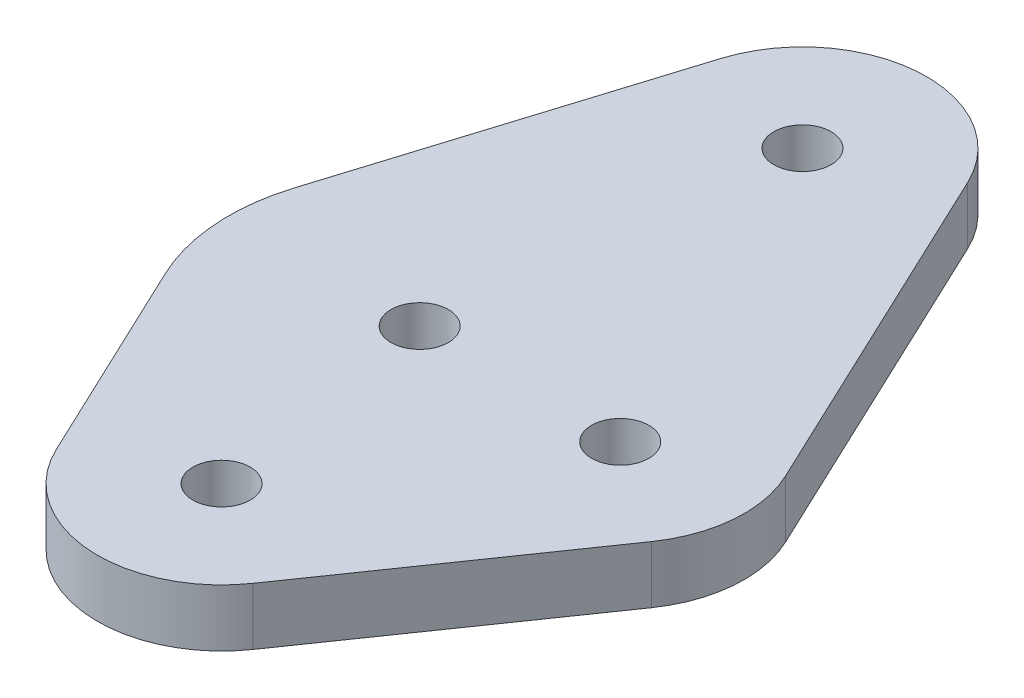
ISO-10303-21;
HEADER;
FILE_DESCRIPTION(('STEP AP214'),'2;1');
FILE_NAME('part.step','',(''),(''),'','','');
FILE_SCHEMA(('AUTOMOTIVE_DESIGN { 1 0 10303 214 1 1 1 1 }'));
ENDSEC;
DATA;
#1=APPLICATION_CONTEXT('core data for automotive mechanical design processes');
#2=APPLICATION_PROTOCOL_DEFINITION('international standard','automotive_design',2000,#1);
#3=PRODUCT_CONTEXT('',#1,'mechanical');
#4=PRODUCT('Part','Part','',(#3));
#5=PRODUCT_RELATED_PRODUCT_CATEGORY('part','',(#4));
#6=PRODUCT_DEFINITION_FORMATION('','',#4);
#7=PRODUCT_DEFINITION_CONTEXT('part definition',#1,'design');
#8=PRODUCT_DEFINITION('design','',#6,#7);
#9=PRODUCT_DEFINITION_SHAPE('','',#8);
#10=(LENGTH_UNIT() NAMED_UNIT(*) SI_UNIT(.MILLI.,.METRE.));
#11=(NAMED_UNIT(*) PLANE_ANGLE_UNIT() SI_UNIT($,.RADIAN.));
#12=(NAMED_UNIT(*) SI_UNIT($,.STERADIAN.) SOLID_ANGLE_UNIT());
#13=UNCERTAINTY_MEASURE_WITH_UNIT(LENGTH_MEASURE(1.E-05),#10,'distance_accuracy_value','');
#14=(GEOMETRIC_REPRESENTATION_CONTEXT(3) GLOBAL_UNCERTAINTY_ASSIGNED_CONTEXT((#13)) GLOBAL_UNIT_ASSIGNED_CONTEXT((#10,
#11,#12)) REPRESENTATION_CONTEXT('',''));
#15=CARTESIAN_POINT('',(0.,0.,0.));
#16=DIRECTION('',(0.,0.,1.));
#17=DIRECTION('',(1.,0.,0.));
#18=AXIS2_PLACEMENT_3D('',#15,#16,#17);
#19=CARTESIAN_POINT('',(-8.54242196177246,3.,-18.0838886035893));
#20=DIRECTION('',(0.,1.,0.));
#21=DIRECTION('',(0.,0.,1.));
#22=AXIS2_PLACEMENT_3D('',#19,#20,#21);
#23=PLANE('',#22);
#24=CARTESIAN_POINT('',(-8.54242196177246,3.,12.3299240479018));
#25=DIRECTION('',(0.,1.,0.));
#26=DIRECTION('',(0.,0.,1.));
#27=AXIS2_PLACEMENT_3D('',#24,#25,#26);
#28=CIRCLE('',#27,1.5);
#29=CARTESIAN_POINT('',(-8.54242196177246,3.,13.8299240479018));
#30=VERTEX_POINT('',#29);
#31=EDGE_CURVE('E188',#30,#30,#28,.T.);
#32=ORIENTED_EDGE('',*,*,#31,.F.);
#33=EDGE_LOOP('',(#32));
#34=FACE_BOUND('',#33,.T.);
#35=CARTESIAN_POINT('',(0.,3.,0.));
#36=DIRECTION('',(0.,1.,0.));
#37=DIRECTION('',(0.,0.,1.));
#38=AXIS2_PLACEMENT_3D('',#35,#36,#37);
#39=CIRCLE('',#38,1.5);
#40=CARTESIAN_POINT('',(0.,3.,1.5));
#41=VERTEX_POINT('',#40);
#42=EDGE_CURVE('E134',#41,#41,#39,.T.);
#43=ORIENTED_EDGE('',*,*,#42,.F.);
#44=EDGE_LOOP('',(#43));
#45=FACE_BOUND('',#44,.T.);
#46=CARTESIAN_POINT('',(-8.54242196177246,3.,-18.0838886035893));
#47=DIRECTION('',(0.,1.,0.));
#48=DIRECTION('',(0.,0.,1.));
#49=AXIS2_PLACEMENT_3D('',#46,#47,#48);
#50=CIRCLE('',#49,6.5);
#51=CARTESIAN_POINT('',(-2.66515816560593,3.,-20.8601757411654));
#52=VERTEX_POINT('',#51);
#53=CARTESIAN_POINT('',(-14.7493059213851,3.,-20.0138086827385));
#54=VERTEX_POINT('',#53);
#55=EDGE_CURVE('E145',#52,#54,#50,.T.);
#56=ORIENTED_EDGE('',*,*,#55,.T.);
#57=DIRECTION('',(-0.29691078140757,0.,0.954905224555791));
#58=VECTOR('',#57,1.);
#59=CARTESIAN_POINT('',(-14.7493059213851,3.,-20.0138086827385));
#60=LINE('',#59,#58);
#61=CARTESIAN_POINT('',(-20.0490522455579,3.,-2.9691078140757));
#62=VERTEX_POINT('',#61);
#63=EDGE_CURVE('E93',#54,#62,#60,.T.);
#64=ORIENTED_EDGE('',*,*,#63,.T.);
#65=CARTESIAN_POINT('',(-10.5,3.,0.));
#66=DIRECTION('',(0.,1.,0.));
#67=DIRECTION('',(0.,0.,1.));
#68=AXIS2_PLACEMENT_3D('',#65,#66,#67);
#69=CIRCLE('',#68,10.);
#70=CARTESIAN_POINT('',(-19.5406392832627,3.,4.2739725490377));
#71=VERTEX_POINT('',#70);
#72=EDGE_CURVE('E160',#62,#71,#69,.T.);
#73=ORIENTED_EDGE('',*,*,#72,.T.);
#74=DIRECTION('',(0.42739725490377,0.,0.904063928326267));
#75=VECTOR('',#74,1.);
#76=CARTESIAN_POINT('',(-19.5406392832627,3.,4.2739725490377));
#77=LINE('',#76,#75);
#78=CARTESIAN_POINT('',(-14.4188374958932,3.,15.1080062047763));
#79=VERTEX_POINT('',#78);
#80=EDGE_CURVE('E173',#71,#79,#77,.T.);
#81=ORIENTED_EDGE('',*,*,#80,.T.);
#82=CARTESIAN_POINT('',(-8.54242196177246,3.,12.3299240479018));
#83=DIRECTION('',(0.,1.,0.));
#84=DIRECTION('',(0.,0.,1.));
#85=AXIS2_PLACEMENT_3D('',#82,#83,#84);
#86=CIRCLE('',#85,6.5);
#87=CARTESIAN_POINT('',(-3.19945487434833,3.,16.0316402313366));
#88=VERTEX_POINT('',#87);
#89=EDGE_CURVE('E112',#79,#88,#86,.T.);
#90=ORIENTED_EDGE('',*,*,#89,.T.);
#91=DIRECTION('',(0.569494797451497,0.,-0.821994936526788));
#92=VECTOR('',#91,1.);
#93=CARTESIAN_POINT('',(5.34296708742412,3.,3.70171618343473));
#94=LINE('',#93,#92);
#95=CARTESIAN_POINT('',(5.34296708742412,3.,3.70171618343473));
#96=VERTEX_POINT('',#95);
#97=EDGE_CURVE('E106',#88,#96,#94,.T.);
#98=ORIENTED_EDGE('',*,*,#97,.T.);
#99=CARTESIAN_POINT('',(0.,3.,0.));
#100=DIRECTION('',(0.,1.,0.));
#101=DIRECTION('',(0.,0.,1.));
#102=AXIS2_PLACEMENT_3D('',#99,#100,#101);
#103=CIRCLE('',#102,6.5);
#104=CARTESIAN_POINT('',(5.87726379616653,3.,-2.77628713757605));
#105=VERTEX_POINT('',#104);
#106=EDGE_CURVE('E110',#96,#105,#103,.T.);
#107=ORIENTED_EDGE('',*,*,#106,.T.);
#108=DIRECTION('',(-0.427121098088623,0.,-0.904194430179466));
#109=VECTOR('',#108,1.);
#110=CARTESIAN_POINT('',(-2.66515816560593,3.,-20.8601757411654));
#111=LINE('',#110,#109);
#112=EDGE_CURVE('E50',#105,#52,#111,.T.);
#113=ORIENTED_EDGE('',*,*,#112,.T.);
#114=EDGE_LOOP('',(#56,#64,#73,#81,#90,#98,#107,#113));
#115=FACE_BOUND('',#114,.T.);
#116=CARTESIAN_POINT('',(-8.54242196177246,3.,-18.0838886035893));
#117=DIRECTION('',(0.,1.,0.));
#118=DIRECTION('',(0.,0.,1.));
#119=AXIS2_PLACEMENT_3D('',#116,#117,#118);
#120=CIRCLE('',#119,1.5);
#121=CARTESIAN_POINT('',(-8.54242196177246,3.,-16.5838886035893));
#122=VERTEX_POINT('',#121);
#123=EDGE_CURVE('E182',#122,#122,#120,.T.);
#124=ORIENTED_EDGE('',*,*,#123,.F.);
#125=EDGE_LOOP('',(#124));
#126=FACE_BOUND('',#125,.T.);
#127=CARTESIAN_POINT('',(-10.5,3.,0.));
#128=DIRECTION('',(0.,1.,0.));
#129=DIRECTION('',(0.,0.,1.));
#130=AXIS2_PLACEMENT_3D('',#127,#128,#129);
#131=CIRCLE('',#130,1.5);
#132=CARTESIAN_POINT('',(-10.5,3.,1.5));
#133=VERTEX_POINT('',#132);
#134=EDGE_CURVE('E194',#133,#133,#131,.T.);
#135=ORIENTED_EDGE('',*,*,#134,.F.);
#136=EDGE_LOOP('',(#135));
#137=FACE_BOUND('',#136,.T.);
#138=ADVANCED_FACE('F33',(#34,#45,#115,#126,#137),#23,.T.);
#139=CARTESIAN_POINT('',(-8.54242196177246,0.,-18.0838886035893));
#140=DIRECTION('',(0.,1.,0.));
#141=DIRECTION('',(0.,0.,1.));
#142=AXIS2_PLACEMENT_3D('',#139,#140,#141);
#143=PLANE('',#142);
#144=CARTESIAN_POINT('',(-8.54242196177246,0.,-18.0838886035893));
#145=DIRECTION('',(0.,1.,0.));
#146=DIRECTION('',(0.,0.,1.));
#147=AXIS2_PLACEMENT_3D('',#144,#145,#146);
#148=CIRCLE('',#147,6.5);
#149=CARTESIAN_POINT('',(-2.66515816560593,0.,-20.8601757411654));
#150=VERTEX_POINT('',#149);
#151=CARTESIAN_POINT('',(-14.7493059213851,0.,-20.0138086827385));
#152=VERTEX_POINT('',#151);
#153=EDGE_CURVE('E130',#150,#152,#148,.T.);
#154=ORIENTED_EDGE('',*,*,#153,.F.);
#155=DIRECTION('',(-0.427121098088623,0.,-0.904194430179466));
#156=VECTOR('',#155,1.);
#157=CARTESIAN_POINT('',(-2.66515816560593,0.,-20.8601757411654));
#158=LINE('',#157,#156);
#159=CARTESIAN_POINT('',(5.87726379616653,0.,-2.77628713757605));
#160=VERTEX_POINT('',#159);
#161=EDGE_CURVE('E85',#160,#150,#158,.T.);
#162=ORIENTED_EDGE('',*,*,#161,.F.);
#163=CARTESIAN_POINT('',(0.,0.,0.));
#164=DIRECTION('',(0.,1.,0.));
#165=DIRECTION('',(0.,0.,1.));
#166=AXIS2_PLACEMENT_3D('',#163,#164,#165);
#167=CIRCLE('',#166,6.5);
#168=CARTESIAN_POINT('',(5.34296708742412,0.,3.70171618343473));
#169=VERTEX_POINT('',#168);
#170=EDGE_CURVE('E79',#169,#160,#167,.T.);
#171=ORIENTED_EDGE('',*,*,#170,.F.);
#172=DIRECTION('',(0.569494797451497,0.,-0.821994936526788));
#173=VECTOR('',#172,1.);
#174=CARTESIAN_POINT('',(5.34296708742412,0.,3.70171618343473));
#175=LINE('',#174,#173);
#176=CARTESIAN_POINT('',(-3.19945487434833,0.,16.0316402313366));
#177=VERTEX_POINT('',#176);
#178=EDGE_CURVE('E120',#177,#169,#175,.T.);
#179=ORIENTED_EDGE('',*,*,#178,.F.);
#180=CARTESIAN_POINT('',(-8.54242196177246,0.,12.3299240479018));
#181=DIRECTION('',(0.,1.,0.));
#182=DIRECTION('',(0.,0.,1.));
#183=AXIS2_PLACEMENT_3D('',#180,#181,#182);
#184=CIRCLE('',#183,6.5);
#185=CARTESIAN_POINT('',(-14.4188374958932,0.,15.1080062047763));
#186=VERTEX_POINT('',#185);
#187=EDGE_CURVE('E140',#186,#177,#184,.T.);
#188=ORIENTED_EDGE('',*,*,#187,.F.);
#189=DIRECTION('',(0.42739725490377,0.,0.904063928326267));
#190=VECTOR('',#189,1.);
#191=CARTESIAN_POINT('',(-19.5406392832627,0.,4.2739725490377));
#192=LINE('',#191,#190);
#193=CARTESIAN_POINT('',(-19.5406392832627,0.,4.2739725490377));
#194=VERTEX_POINT('',#193);
#195=EDGE_CURVE('E138',#194,#186,#192,.T.);
#196=ORIENTED_EDGE('',*,*,#195,.F.);
#197=CARTESIAN_POINT('',(-10.5,0.,0.));
#198=DIRECTION('',(0.,1.,0.));
#199=DIRECTION('',(0.,0.,1.));
#200=AXIS2_PLACEMENT_3D('',#197,#198,#199);
#201=CIRCLE('',#200,10.);
#202=CARTESIAN_POINT('',(-20.0490522455579,0.,-2.9691078140757));
#203=VERTEX_POINT('',#202);
#204=EDGE_CURVE('E136',#203,#194,#201,.T.);
#205=ORIENTED_EDGE('',*,*,#204,.F.);
#206=DIRECTION('',(-0.29691078140757,0.,0.954905224555791));
#207=VECTOR('',#206,1.);
#208=CARTESIAN_POINT('',(-14.7493059213851,0.,-20.0138086827385));
#209=LINE('',#208,#207);
#210=EDGE_CURVE('E133',#152,#203,#209,.T.);
#211=ORIENTED_EDGE('',*,*,#210,.F.);
#212=EDGE_LOOP('',(#154,#162,#171,#179,#188,#196,#205,#211));
#213=FACE_BOUND('',#212,.T.);
#214=CARTESIAN_POINT('',(0.,0.,0.));
#215=DIRECTION('',(0.,1.,0.));
#216=DIRECTION('',(0.,0.,1.));
#217=AXIS2_PLACEMENT_3D('',#214,#215,#216);
#218=CIRCLE('',#217,1.5);
#219=CARTESIAN_POINT('',(0.,0.,1.5));
#220=VERTEX_POINT('',#219);
#221=EDGE_CURVE('E179',#220,#220,#218,.T.);
#222=ORIENTED_EDGE('',*,*,#221,.T.);
#223=EDGE_LOOP('',(#222));
#224=FACE_BOUND('',#223,.T.);
#225=CARTESIAN_POINT('',(-8.54242196177246,0.,-18.0838886035893));
#226=DIRECTION('',(0.,1.,0.));
#227=DIRECTION('',(0.,0.,1.));
#228=AXIS2_PLACEMENT_3D('',#225,#226,#227);
#229=CIRCLE('',#228,1.5);
#230=CARTESIAN_POINT('',(-8.54242196177246,0.,-16.5838886035893));
#231=VERTEX_POINT('',#230);
#232=EDGE_CURVE('E185',#231,#231,#229,.T.);
#233=ORIENTED_EDGE('',*,*,#232,.T.);
#234=EDGE_LOOP('',(#233));
#235=FACE_BOUND('',#234,.T.);
#236=CARTESIAN_POINT('',(-8.54242196177246,0.,12.3299240479018));
#237=DIRECTION('',(0.,1.,0.));
#238=DIRECTION('',(0.,0.,1.));
#239=AXIS2_PLACEMENT_3D('',#236,#237,#238);
#240=CIRCLE('',#239,1.5);
#241=CARTESIAN_POINT('',(-8.54242196177246,0.,13.8299240479018));
#242=VERTEX_POINT('',#241);
#243=EDGE_CURVE('E191',#242,#242,#240,.T.);
#244=ORIENTED_EDGE('',*,*,#243,.T.);
#245=EDGE_LOOP('',(#244));
#246=FACE_BOUND('',#245,.T.);
#247=CARTESIAN_POINT('',(-10.5,0.,0.));
#248=DIRECTION('',(0.,1.,0.));
#249=DIRECTION('',(0.,0.,1.));
#250=AXIS2_PLACEMENT_3D('',#247,#248,#249);
#251=CIRCLE('',#250,1.5);
#252=CARTESIAN_POINT('',(-10.5,0.,1.5));
#253=VERTEX_POINT('',#252);
#254=EDGE_CURVE('E197',#253,#253,#251,.T.);
#255=ORIENTED_EDGE('',*,*,#254,.T.);
#256=EDGE_LOOP('',(#255));
#257=FACE_BOUND('',#256,.T.);
#258=ADVANCED_FACE('F164',(#213,#224,#235,#246,#257),#143,.F.);
#259=CARTESIAN_POINT('',(-8.54242196177246,3.,-18.0838886035893));
#260=DIRECTION('',(0.,-1.,0.));
#261=DIRECTION('',(0.,0.,-1.));
#262=AXIS2_PLACEMENT_3D('',#259,#260,#261);
#263=CYLINDRICAL_SURFACE('',#262,6.5);
#264=ORIENTED_EDGE('',*,*,#153,.T.);
#265=DIRECTION('',(0.,-1.,0.));
#266=VECTOR('',#265,1.);
#267=CARTESIAN_POINT('',(-14.7493059213851,3.,-20.0138086827385));
#268=LINE('',#267,#266);
#269=EDGE_CURVE('E11',#54,#152,#268,.T.);
#270=ORIENTED_EDGE('',*,*,#269,.F.);
#271=ORIENTED_EDGE('',*,*,#55,.F.);
#272=DIRECTION('',(0.,-1.,0.));
#273=VECTOR('',#272,1.);
#274=CARTESIAN_POINT('',(-2.66515816560593,3.,-20.8601757411654));
#275=LINE('',#274,#273);
#276=EDGE_CURVE('E126',#52,#150,#275,.T.);
#277=ORIENTED_EDGE('',*,*,#276,.T.);
#278=EDGE_LOOP('',(#264,#270,#271,#277));
#279=FACE_BOUND('',#278,.T.);
#280=ADVANCED_FACE('F35',(#279),#263,.T.);
#281=CARTESIAN_POINT('',(-14.7493059213851,3.,-20.0138086827385));
#282=DIRECTION('',(0.954905224555791,0.,0.29691078140757));
#283=DIRECTION('',(0.29691078140757,0.,-0.954905224555791));
#284=AXIS2_PLACEMENT_3D('',#281,#282,#283);
#285=PLANE('',#284);
#286=ORIENTED_EDGE('',*,*,#210,.T.);
#287=DIRECTION('',(0.,-1.,0.));
#288=VECTOR('',#287,1.);
#289=CARTESIAN_POINT('',(-20.0490522455579,3.,-2.9691078140757));
#290=LINE('',#289,#288);
#291=EDGE_CURVE('E42',#62,#203,#290,.T.);
#292=ORIENTED_EDGE('',*,*,#291,.F.);
#293=ORIENTED_EDGE('',*,*,#63,.F.);
#294=ORIENTED_EDGE('',*,*,#269,.T.);
#295=EDGE_LOOP('',(#286,#292,#293,#294));
#296=FACE_BOUND('',#295,.T.);
#297=ADVANCED_FACE('F231',(#296),#285,.F.);
#298=CARTESIAN_POINT('',(-10.5,3.,0.));
#299=DIRECTION('',(0.,-1.,0.));
#300=DIRECTION('',(0.,0.,-1.));
#301=AXIS2_PLACEMENT_3D('',#298,#299,#300);
#302=CYLINDRICAL_SURFACE('',#301,10.);
#303=ORIENTED_EDGE('',*,*,#204,.T.);
#304=DIRECTION('',(0.,-1.,0.));
#305=VECTOR('',#304,1.);
#306=CARTESIAN_POINT('',(-19.5406392832627,3.,4.2739725490377));
#307=LINE('',#306,#305);
#308=EDGE_CURVE('E152',#71,#194,#307,.T.);
#309=ORIENTED_EDGE('',*,*,#308,.F.);
#310=ORIENTED_EDGE('',*,*,#72,.F.);
#311=ORIENTED_EDGE('',*,*,#291,.T.);
#312=EDGE_LOOP('',(#303,#309,#310,#311));
#313=FACE_BOUND('',#312,.T.);
#314=ADVANCED_FACE('F158',(#313),#302,.T.);
#315=CARTESIAN_POINT('',(-19.5406392832627,3.,4.2739725490377));
#316=DIRECTION('',(0.904063928326267,0.,-0.42739725490377));
#317=DIRECTION('',(-0.42739725490377,0.,-0.904063928326267));
#318=AXIS2_PLACEMENT_3D('',#315,#316,#317);
#319=PLANE('',#318);
#320=ORIENTED_EDGE('',*,*,#195,.T.);
#321=DIRECTION('',(0.,-1.,0.));
#322=VECTOR('',#321,1.);
#323=CARTESIAN_POINT('',(-14.4188374958932,3.,15.1080062047763));
#324=LINE('',#323,#322);
#325=EDGE_CURVE('E149',#79,#186,#324,.T.);
#326=ORIENTED_EDGE('',*,*,#325,.F.);
#327=ORIENTED_EDGE('',*,*,#80,.F.);
#328=ORIENTED_EDGE('',*,*,#308,.T.);
#329=EDGE_LOOP('',(#320,#326,#327,#328));
#330=FACE_BOUND('',#329,.T.);
#331=ADVANCED_FACE('F169',(#330),#319,.F.);
#332=CARTESIAN_POINT('',(-8.54242196177246,3.,12.3299240479018));
#333=DIRECTION('',(0.,-1.,0.));
#334=DIRECTION('',(0.,0.,-1.));
#335=AXIS2_PLACEMENT_3D('',#332,#333,#334);
#336=CYLINDRICAL_SURFACE('',#335,6.5);
#337=ORIENTED_EDGE('',*,*,#187,.T.);
#338=DIRECTION('',(0.,-1.,0.));
#339=VECTOR('',#338,1.);
#340=CARTESIAN_POINT('',(-3.19945487434833,3.,16.0316402313366));
#341=LINE('',#340,#339);
#342=EDGE_CURVE('E121',#88,#177,#341,.T.);
#343=ORIENTED_EDGE('',*,*,#342,.F.);
#344=ORIENTED_EDGE('',*,*,#89,.F.);
#345=ORIENTED_EDGE('',*,*,#325,.T.);
#346=EDGE_LOOP('',(#337,#343,#344,#345));
#347=FACE_BOUND('',#346,.T.);
#348=ADVANCED_FACE('F172',(#347),#336,.T.);
#349=CARTESIAN_POINT('',(5.34296708742412,3.,3.70171618343473));
#350=DIRECTION('',(-0.821994936526788,0.,-0.569494797451497));
#351=DIRECTION('',(-0.569494797451497,0.,0.821994936526788));
#352=AXIS2_PLACEMENT_3D('',#349,#350,#351);
#353=PLANE('',#352);
#354=ORIENTED_EDGE('',*,*,#178,.T.);
#355=DIRECTION('',(0.,-1.,0.));
#356=VECTOR('',#355,1.);
#357=CARTESIAN_POINT('',(5.34296708742412,3.,3.70171618343473));
#358=LINE('',#357,#356);
#359=EDGE_CURVE('E117',#96,#169,#358,.T.);
#360=ORIENTED_EDGE('',*,*,#359,.F.);
#361=ORIENTED_EDGE('',*,*,#97,.F.);
#362=ORIENTED_EDGE('',*,*,#342,.T.);
#363=EDGE_LOOP('',(#354,#360,#361,#362));
#364=FACE_BOUND('',#363,.T.);
#365=ADVANCED_FACE('F118',(#364),#353,.F.);
#366=CARTESIAN_POINT('',(0.,3.,0.));
#367=DIRECTION('',(0.,-1.,0.));
#368=DIRECTION('',(0.,0.,-1.));
#369=AXIS2_PLACEMENT_3D('',#366,#367,#368);
#370=CYLINDRICAL_SURFACE('',#369,6.5);
#371=ORIENTED_EDGE('',*,*,#170,.T.);
#372=DIRECTION('',(0.,-1.,0.));
#373=VECTOR('',#372,1.);
#374=CARTESIAN_POINT('',(5.87726379616653,3.,-2.77628713757605));
#375=LINE('',#374,#373);
#376=EDGE_CURVE('E122',#105,#160,#375,.T.);
#377=ORIENTED_EDGE('',*,*,#376,.F.);
#378=ORIENTED_EDGE('',*,*,#106,.F.);
#379=ORIENTED_EDGE('',*,*,#359,.T.);
#380=EDGE_LOOP('',(#371,#377,#378,#379));
#381=FACE_BOUND('',#380,.T.);
#382=ADVANCED_FACE('F124',(#381),#370,.T.);
#383=CARTESIAN_POINT('',(-2.66515816560593,3.,-20.8601757411654));
#384=DIRECTION('',(-0.904194430179466,0.,0.427121098088623));
#385=DIRECTION('',(0.427121098088623,0.,0.904194430179466));
#386=AXIS2_PLACEMENT_3D('',#383,#384,#385);
#387=PLANE('',#386);
#388=ORIENTED_EDGE('',*,*,#161,.T.);
#389=ORIENTED_EDGE('',*,*,#276,.F.);
#390=ORIENTED_EDGE('',*,*,#112,.F.);
#391=ORIENTED_EDGE('',*,*,#376,.T.);
#392=EDGE_LOOP('',(#388,#389,#390,#391));
#393=FACE_BOUND('',#392,.T.);
#394=ADVANCED_FACE('F219',(#393),#387,.F.);
#395=CARTESIAN_POINT('',(0.,3.,0.));
#396=DIRECTION('',(0.,-1.,0.));
#397=DIRECTION('',(0.,0.,-1.));
#398=AXIS2_PLACEMENT_3D('',#395,#396,#397);
#399=CYLINDRICAL_SURFACE('',#398,1.5);
#400=ORIENTED_EDGE('',*,*,#42,.T.);
#401=EDGE_LOOP('',(#400));
#402=FACE_BOUND('',#401,.T.);
#403=ORIENTED_EDGE('',*,*,#221,.F.);
#404=EDGE_LOOP('',(#403));
#405=FACE_BOUND('',#404,.T.);
#406=ADVANCED_FACE('F216',(#402,#405),#399,.F.);
#407=CARTESIAN_POINT('',(-8.54242196177246,3.,-18.0838886035893));
#408=DIRECTION('',(0.,-1.,0.));
#409=DIRECTION('',(0.,0.,-1.));
#410=AXIS2_PLACEMENT_3D('',#407,#408,#409);
#411=CYLINDRICAL_SURFACE('',#410,1.5);
#412=ORIENTED_EDGE('',*,*,#123,.T.);
#413=EDGE_LOOP('',(#412));
#414=FACE_BOUND('',#413,.T.);
#415=ORIENTED_EDGE('',*,*,#232,.F.);
#416=EDGE_LOOP('',(#415));
#417=FACE_BOUND('',#416,.T.);
#418=ADVANCED_FACE('F295',(#414,#417),#411,.F.);
#419=CARTESIAN_POINT('',(-8.54242196177246,3.,12.3299240479018));
#420=DIRECTION('',(0.,-1.,0.));
#421=DIRECTION('',(0.,0.,-1.));
#422=AXIS2_PLACEMENT_3D('',#419,#420,#421);
#423=CYLINDRICAL_SURFACE('',#422,1.5);
#424=ORIENTED_EDGE('',*,*,#31,.T.);
#425=EDGE_LOOP('',(#424));
#426=FACE_BOUND('',#425,.T.);
#427=ORIENTED_EDGE('',*,*,#243,.F.);
#428=EDGE_LOOP('',(#427));
#429=FACE_BOUND('',#428,.T.);
#430=ADVANCED_FACE('F303',(#426,#429),#423,.F.);
#431=CARTESIAN_POINT('',(-10.5,3.,0.));
#432=DIRECTION('',(0.,-1.,0.));
#433=DIRECTION('',(0.,0.,-1.));
#434=AXIS2_PLACEMENT_3D('',#431,#432,#433);
#435=CYLINDRICAL_SURFACE('',#434,1.5);
#436=ORIENTED_EDGE('',*,*,#134,.T.);
#437=EDGE_LOOP('',(#436));
#438=FACE_BOUND('',#437,.T.);
#439=ORIENTED_EDGE('',*,*,#254,.F.);
#440=EDGE_LOOP('',(#439));
#441=FACE_BOUND('',#440,.T.);
#442=ADVANCED_FACE('F203',(#438,#441),#435,.F.);
#443=CLOSED_SHELL('',(#138,#258,#280,#297,#314,#331,#348,#365,#382,#394,#406,#418,#430,#442));
#444=MANIFOLD_SOLID_BREP('B2',#443);
#445=ADVANCED_BREP_SHAPE_REPRESENTATION('',(#18,#444),#14);
#446=SHAPE_DEFINITION_REPRESENTATION(#9,#445);
ENDSEC;
END-ISO-10303-21;
